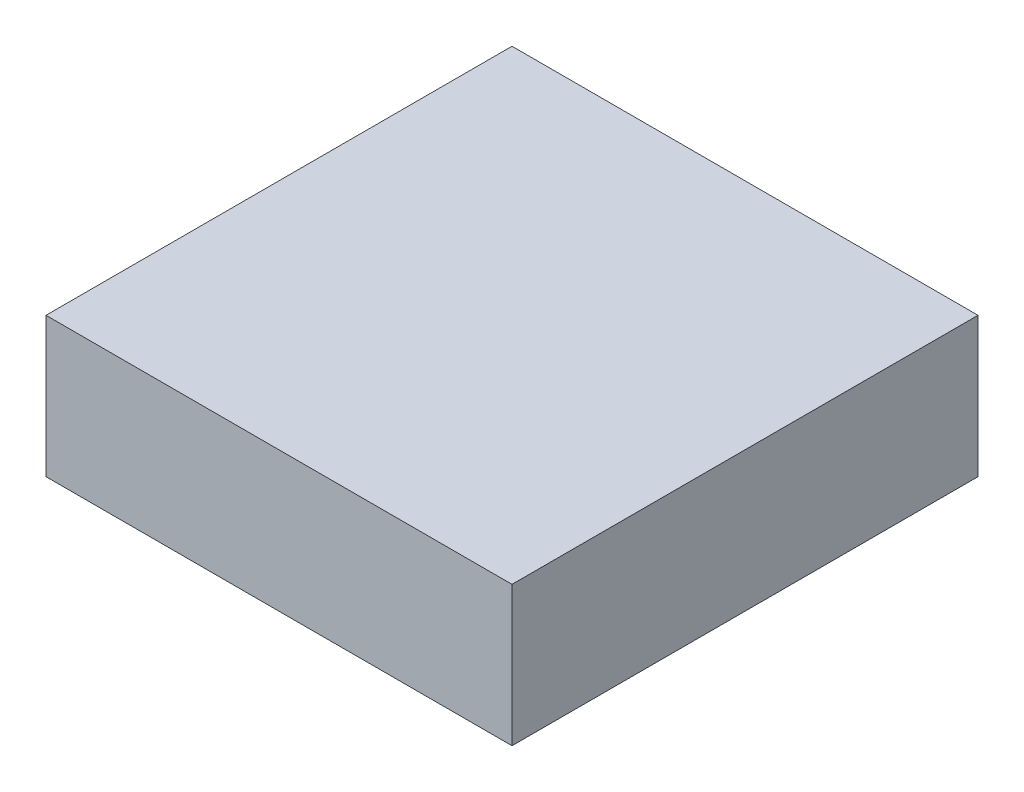
ISO-10303-21;
HEADER;
FILE_DESCRIPTION(('STEP AP214'),'2;1');
FILE_NAME('part.step','',(''),(''),'','','');
FILE_SCHEMA(('AUTOMOTIVE_DESIGN { 1 0 10303 214 1 1 1 1 }'));
ENDSEC;
DATA;
#1=APPLICATION_CONTEXT('core data for automotive mechanical design processes');
#2=APPLICATION_PROTOCOL_DEFINITION('international standard','automotive_design',2000,#1);
#3=PRODUCT_CONTEXT('',#1,'mechanical');
#4=PRODUCT('Part','Part','',(#3));
#5=PRODUCT_RELATED_PRODUCT_CATEGORY('part','',(#4));
#6=PRODUCT_DEFINITION_FORMATION('','',#4);
#7=PRODUCT_DEFINITION_CONTEXT('part definition',#1,'design');
#8=PRODUCT_DEFINITION('design','',#6,#7);
#9=PRODUCT_DEFINITION_SHAPE('','',#8);
#10=(LENGTH_UNIT() NAMED_UNIT(*) SI_UNIT(.MILLI.,.METRE.));
#11=(NAMED_UNIT(*) PLANE_ANGLE_UNIT() SI_UNIT($,.RADIAN.));
#12=(NAMED_UNIT(*) SI_UNIT($,.STERADIAN.) SOLID_ANGLE_UNIT());
#13=UNCERTAINTY_MEASURE_WITH_UNIT(LENGTH_MEASURE(1.E-05),#10,'distance_accuracy_value','');
#14=(GEOMETRIC_REPRESENTATION_CONTEXT(3) GLOBAL_UNCERTAINTY_ASSIGNED_CONTEXT((#13)) GLOBAL_UNIT_ASSIGNED_CONTEXT((#10,
#11,#12)) REPRESENTATION_CONTEXT('',''));
#15=CARTESIAN_POINT('',(0.,0.,0.));
#16=DIRECTION('',(0.,0.,1.));
#17=DIRECTION('',(1.,0.,0.));
#18=AXIS2_PLACEMENT_3D('',#15,#16,#17);
#19=CARTESIAN_POINT('',(5.,3.,-5.));
#20=DIRECTION('',(-1.,0.,0.));
#21=DIRECTION('',(0.,0.,1.));
#22=AXIS2_PLACEMENT_3D('',#19,#20,#21);
#23=PLANE('',#22);
#24=DIRECTION('',(0.,0.,-1.));
#25=VECTOR('',#24,1.);
#26=CARTESIAN_POINT('',(5.,0.,-5.));
#27=LINE('',#26,#25);
#28=CARTESIAN_POINT('',(5.,0.,5.));
#29=VERTEX_POINT('',#28);
#30=CARTESIAN_POINT('',(5.,0.,-5.));
#31=VERTEX_POINT('',#30);
#32=EDGE_CURVE('E102',#29,#31,#27,.T.);
#33=ORIENTED_EDGE('',*,*,#32,.T.);
#34=DIRECTION('',(0.,-1.,0.));
#35=VECTOR('',#34,1.);
#36=CARTESIAN_POINT('',(5.,3.,-5.));
#37=LINE('',#36,#35);
#38=CARTESIAN_POINT('',(5.,3.,-5.));
#39=VERTEX_POINT('',#38);
#40=EDGE_CURVE('E11',#39,#31,#37,.T.);
#41=ORIENTED_EDGE('',*,*,#40,.F.);
#42=DIRECTION('',(0.,0.,-1.));
#43=VECTOR('',#42,1.);
#44=CARTESIAN_POINT('',(5.,3.,-5.));
#45=LINE('',#44,#43);
#46=CARTESIAN_POINT('',(5.,3.,5.));
#47=VERTEX_POINT('',#46);
#48=EDGE_CURVE('E90',#47,#39,#45,.T.);
#49=ORIENTED_EDGE('',*,*,#48,.F.);
#50=DIRECTION('',(0.,-1.,0.));
#51=VECTOR('',#50,1.);
#52=CARTESIAN_POINT('',(5.,3.,5.));
#53=LINE('',#52,#51);
#54=EDGE_CURVE('E98',#47,#29,#53,.T.);
#55=ORIENTED_EDGE('',*,*,#54,.T.);
#56=EDGE_LOOP('',(#33,#41,#49,#55));
#57=FACE_BOUND('',#56,.T.);
#58=ADVANCED_FACE('F39',(#57),#23,.F.);
#59=CARTESIAN_POINT('',(-5.,3.,-5.));
#60=DIRECTION('',(0.,0.,1.));
#61=DIRECTION('',(1.,0.,0.));
#62=AXIS2_PLACEMENT_3D('',#59,#60,#61);
#63=PLANE('',#62);
#64=DIRECTION('',(-1.,0.,0.));
#65=VECTOR('',#64,1.);
#66=CARTESIAN_POINT('',(-5.,0.,-5.));
#67=LINE('',#66,#65);
#68=CARTESIAN_POINT('',(-5.,0.,-5.));
#69=VERTEX_POINT('',#68);
#70=EDGE_CURVE('E94',#31,#69,#67,.T.);
#71=ORIENTED_EDGE('',*,*,#70,.T.);
#72=DIRECTION('',(0.,-1.,0.));
#73=VECTOR('',#72,1.);
#74=CARTESIAN_POINT('',(-5.,3.,-5.));
#75=LINE('',#74,#73);
#76=CARTESIAN_POINT('',(-5.,3.,-5.));
#77=VERTEX_POINT('',#76);
#78=EDGE_CURVE('E47',#77,#69,#75,.T.);
#79=ORIENTED_EDGE('',*,*,#78,.F.);
#80=DIRECTION('',(-1.,0.,0.));
#81=VECTOR('',#80,1.);
#82=CARTESIAN_POINT('',(-5.,3.,-5.));
#83=LINE('',#82,#81);
#84=EDGE_CURVE('E85',#39,#77,#83,.T.);
#85=ORIENTED_EDGE('',*,*,#84,.F.);
#86=ORIENTED_EDGE('',*,*,#40,.T.);
#87=EDGE_LOOP('',(#71,#79,#85,#86));
#88=FACE_BOUND('',#87,.T.);
#89=ADVANCED_FACE('F93',(#88),#63,.F.);
#90=CARTESIAN_POINT('',(-5.,3.,-5.));
#91=DIRECTION('',(1.,0.,0.));
#92=DIRECTION('',(0.,0.,-1.));
#93=AXIS2_PLACEMENT_3D('',#90,#91,#92);
#94=PLANE('',#93);
#95=DIRECTION('',(0.,0.,1.));
#96=VECTOR('',#95,1.);
#97=CARTESIAN_POINT('',(-5.,0.,-5.));
#98=LINE('',#97,#96);
#99=CARTESIAN_POINT('',(-5.,0.,5.));
#100=VERTEX_POINT('',#99);
#101=EDGE_CURVE('E72',#69,#100,#98,.T.);
#102=ORIENTED_EDGE('',*,*,#101,.T.);
#103=DIRECTION('',(0.,-1.,0.));
#104=VECTOR('',#103,1.);
#105=CARTESIAN_POINT('',(-5.,3.,5.));
#106=LINE('',#105,#104);
#107=CARTESIAN_POINT('',(-5.,3.,5.));
#108=VERTEX_POINT('',#107);
#109=EDGE_CURVE('E95',#108,#100,#106,.T.);
#110=ORIENTED_EDGE('',*,*,#109,.F.);
#111=DIRECTION('',(0.,0.,1.));
#112=VECTOR('',#111,1.);
#113=CARTESIAN_POINT('',(-5.,3.,-5.));
#114=LINE('',#113,#112);
#115=EDGE_CURVE('E88',#77,#108,#114,.T.);
#116=ORIENTED_EDGE('',*,*,#115,.F.);
#117=ORIENTED_EDGE('',*,*,#78,.T.);
#118=EDGE_LOOP('',(#102,#110,#116,#117));
#119=FACE_BOUND('',#118,.T.);
#120=ADVANCED_FACE('F96',(#119),#94,.F.);
#121=CARTESIAN_POINT('',(-5.,3.,5.));
#122=DIRECTION('',(0.,0.,-1.));
#123=DIRECTION('',(-1.,0.,0.));
#124=AXIS2_PLACEMENT_3D('',#121,#122,#123);
#125=PLANE('',#124);
#126=DIRECTION('',(1.,0.,0.));
#127=VECTOR('',#126,1.);
#128=CARTESIAN_POINT('',(-5.,0.,5.));
#129=LINE('',#128,#127);
#130=EDGE_CURVE('E78',#100,#29,#129,.T.);
#131=ORIENTED_EDGE('',*,*,#130,.T.);
#132=ORIENTED_EDGE('',*,*,#54,.F.);
#133=DIRECTION('',(1.,0.,0.));
#134=VECTOR('',#133,1.);
#135=CARTESIAN_POINT('',(-5.,3.,5.));
#136=LINE('',#135,#134);
#137=EDGE_CURVE('E55',#108,#47,#136,.T.);
#138=ORIENTED_EDGE('',*,*,#137,.F.);
#139=ORIENTED_EDGE('',*,*,#109,.T.);
#140=EDGE_LOOP('',(#131,#132,#138,#139));
#141=FACE_BOUND('',#140,.T.);
#142=ADVANCED_FACE('F109',(#141),#125,.F.);
#143=CARTESIAN_POINT('',(0.,3.,0.));
#144=DIRECTION('',(0.,1.,0.));
#145=DIRECTION('',(0.,0.,1.));
#146=AXIS2_PLACEMENT_3D('',#143,#144,#145);
#147=PLANE('',#146);
#148=ORIENTED_EDGE('',*,*,#48,.T.);
#149=ORIENTED_EDGE('',*,*,#84,.T.);
#150=ORIENTED_EDGE('',*,*,#115,.T.);
#151=ORIENTED_EDGE('',*,*,#137,.T.);
#152=EDGE_LOOP('',(#148,#149,#150,#151));
#153=FACE_BOUND('',#152,.T.);
#154=ADVANCED_FACE('F86',(#153),#147,.T.);
#155=CARTESIAN_POINT('',(0.,0.,0.));
#156=DIRECTION('',(0.,1.,0.));
#157=DIRECTION('',(0.,0.,1.));
#158=AXIS2_PLACEMENT_3D('',#155,#156,#157);
#159=PLANE('',#158);
#160=ORIENTED_EDGE('',*,*,#32,.F.);
#161=ORIENTED_EDGE('',*,*,#130,.F.);
#162=ORIENTED_EDGE('',*,*,#101,.F.);
#163=ORIENTED_EDGE('',*,*,#70,.F.);
#164=EDGE_LOOP('',(#160,#161,#162,#163));
#165=FACE_BOUND('',#164,.T.);
#166=ADVANCED_FACE('F112',(#165),#159,.F.);
#167=CLOSED_SHELL('',(#58,#89,#120,#142,#154,#166));
#168=MANIFOLD_SOLID_BREP('B2',#167);
#169=ADVANCED_BREP_SHAPE_REPRESENTATION('',(#18,#168),#14);
#170=SHAPE_DEFINITION_REPRESENTATION(#9,#169);
ENDSEC;
END-ISO-10303-21;
